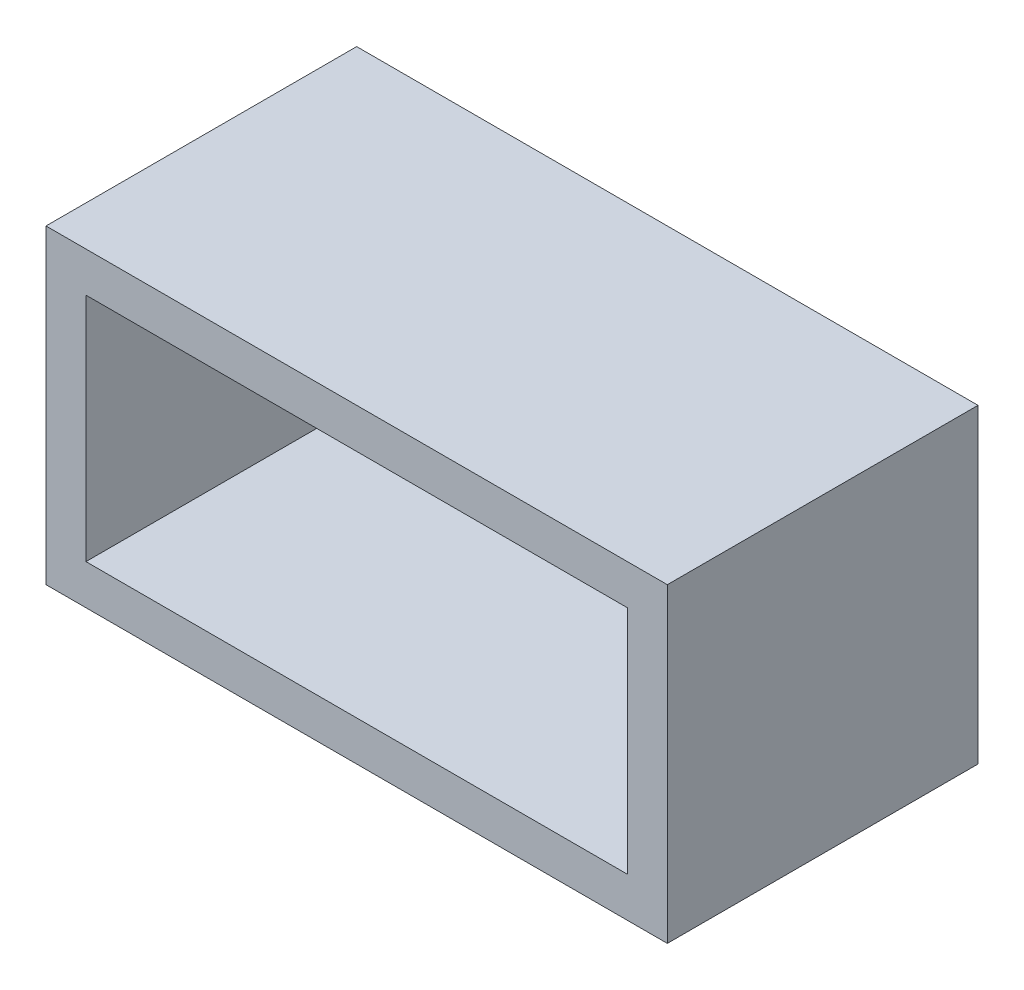
ISO-10303-21;
HEADER;
FILE_DESCRIPTION(('STEP AP214'),'2;1');
FILE_NAME('part.step','',(''),(''),'','','');
FILE_SCHEMA(('AUTOMOTIVE_DESIGN { 1 0 10303 214 1 1 1 1 }'));
ENDSEC;
DATA;
#1=APPLICATION_CONTEXT('core data for automotive mechanical design processes');
#2=APPLICATION_PROTOCOL_DEFINITION('international standard','automotive_design',2000,#1);
#3=PRODUCT_CONTEXT('',#1,'mechanical');
#4=PRODUCT('Part','Part','',(#3));
#5=PRODUCT_RELATED_PRODUCT_CATEGORY('part','',(#4));
#6=PRODUCT_DEFINITION_FORMATION('','',#4);
#7=PRODUCT_DEFINITION_CONTEXT('part definition',#1,'design');
#8=PRODUCT_DEFINITION('design','',#6,#7);
#9=PRODUCT_DEFINITION_SHAPE('','',#8);
#10=(LENGTH_UNIT() NAMED_UNIT(*) SI_UNIT(.MILLI.,.METRE.));
#11=(NAMED_UNIT(*) PLANE_ANGLE_UNIT() SI_UNIT($,.RADIAN.));
#12=(NAMED_UNIT(*) SI_UNIT($,.STERADIAN.) SOLID_ANGLE_UNIT());
#13=UNCERTAINTY_MEASURE_WITH_UNIT(LENGTH_MEASURE(1.E-05),#10,'distance_accuracy_value','');
#14=(GEOMETRIC_REPRESENTATION_CONTEXT(3) GLOBAL_UNCERTAINTY_ASSIGNED_CONTEXT((#13)) GLOBAL_UNIT_ASSIGNED_CONTEXT((#10,
#11,#12)) REPRESENTATION_CONTEXT('',''));
#15=CARTESIAN_POINT('',(0.,0.,0.));
#16=DIRECTION('',(0.,0.,1.));
#17=DIRECTION('',(1.,0.,0.));
#18=AXIS2_PLACEMENT_3D('',#15,#16,#17);
#19=CARTESIAN_POINT('',(0.,0.,6.));
#20=DIRECTION('',(0.,0.,-1.));
#21=DIRECTION('',(-1.,0.,0.));
#22=AXIS2_PLACEMENT_3D('',#19,#20,#21);
#23=PLANE('',#22);
#24=DIRECTION('',(0.,-1.,0.));
#25=VECTOR('',#24,1.);
#26=CARTESIAN_POINT('',(14.,-21.,6.));
#27=LINE('',#26,#25);
#28=CARTESIAN_POINT('',(14.,-14.,6.));
#29=VERTEX_POINT('',#28);
#30=CARTESIAN_POINT('',(14.,-21.,6.));
#31=VERTEX_POINT('',#30);
#32=EDGE_CURVE('E154',#29,#31,#27,.T.);
#33=ORIENTED_EDGE('',*,*,#32,.T.);
#34=DIRECTION('',(1.,0.,0.));
#35=VECTOR('',#34,1.);
#36=CARTESIAN_POINT('',(14.,-21.,6.));
#37=LINE('',#36,#35);
#38=CARTESIAN_POINT('',(28.,-21.,6.));
#39=VERTEX_POINT('',#38);
#40=EDGE_CURVE('E98',#31,#39,#37,.T.);
#41=ORIENTED_EDGE('',*,*,#40,.T.);
#42=DIRECTION('',(0.,1.,0.));
#43=VECTOR('',#42,1.);
#44=CARTESIAN_POINT('',(28.,-21.,6.));
#45=LINE('',#44,#43);
#46=CARTESIAN_POINT('',(28.,-14.,6.));
#47=VERTEX_POINT('',#46);
#48=EDGE_CURVE('E158',#39,#47,#45,.T.);
#49=ORIENTED_EDGE('',*,*,#48,.T.);
#50=DIRECTION('',(-1.,0.,0.));
#51=VECTOR('',#50,1.);
#52=CARTESIAN_POINT('',(14.,-14.,6.));
#53=LINE('',#52,#51);
#54=EDGE_CURVE('E68',#47,#29,#53,.T.);
#55=ORIENTED_EDGE('',*,*,#54,.T.);
#56=EDGE_LOOP('',(#33,#41,#49,#55));
#57=FACE_BOUND('',#56,.T.);
#58=DIRECTION('',(0.,-1.,0.));
#59=VECTOR('',#58,1.);
#60=CARTESIAN_POINT('',(14.9,0.,6.));
#61=LINE('',#60,#59);
#62=CARTESIAN_POINT('',(14.9,-14.9,6.));
#63=VERTEX_POINT('',#62);
#64=CARTESIAN_POINT('',(14.9,-20.1,6.));
#65=VERTEX_POINT('',#64);
#66=EDGE_CURVE('E11',#63,#65,#61,.T.);
#67=ORIENTED_EDGE('',*,*,#66,.F.);
#68=DIRECTION('',(-1.,0.,0.));
#69=VECTOR('',#68,1.);
#70=CARTESIAN_POINT('',(0.,-14.9,6.));
#71=LINE('',#70,#69);
#72=CARTESIAN_POINT('',(27.1,-14.9,6.));
#73=VERTEX_POINT('',#72);
#74=EDGE_CURVE('E176',#73,#63,#71,.T.);
#75=ORIENTED_EDGE('',*,*,#74,.F.);
#76=DIRECTION('',(0.,1.,0.));
#77=VECTOR('',#76,1.);
#78=CARTESIAN_POINT('',(27.1,0.,6.));
#79=LINE('',#78,#77);
#80=CARTESIAN_POINT('',(27.1,-20.1,6.));
#81=VERTEX_POINT('',#80);
#82=EDGE_CURVE('E178',#81,#73,#79,.T.);
#83=ORIENTED_EDGE('',*,*,#82,.F.);
#84=DIRECTION('',(1.,0.,0.));
#85=VECTOR('',#84,1.);
#86=CARTESIAN_POINT('',(0.,-20.1,6.));
#87=LINE('',#86,#85);
#88=EDGE_CURVE('E55',#65,#81,#87,.T.);
#89=ORIENTED_EDGE('',*,*,#88,.F.);
#90=EDGE_LOOP('',(#67,#75,#83,#89));
#91=FACE_BOUND('',#90,.T.);
#92=ADVANCED_FACE('F43',(#57,#91),#23,.F.);
#93=CARTESIAN_POINT('',(14.,-21.,6.));
#94=DIRECTION('',(1.,0.,0.));
#95=DIRECTION('',(0.,0.,-1.));
#96=AXIS2_PLACEMENT_3D('',#93,#94,#95);
#97=PLANE('',#96);
#98=DIRECTION('',(0.,-1.,0.));
#99=VECTOR('',#98,1.);
#100=CARTESIAN_POINT('',(14.,-21.,-1.));
#101=LINE('',#100,#99);
#102=CARTESIAN_POINT('',(14.,-14.,-1.));
#103=VERTEX_POINT('',#102);
#104=CARTESIAN_POINT('',(14.,-21.,-1.));
#105=VERTEX_POINT('',#104);
#106=EDGE_CURVE('E126',#103,#105,#101,.T.);
#107=ORIENTED_EDGE('',*,*,#106,.T.);
#108=DIRECTION('',(0.,0.,-1.));
#109=VECTOR('',#108,1.);
#110=CARTESIAN_POINT('',(14.,-21.,6.));
#111=LINE('',#110,#109);
#112=EDGE_CURVE('E173',#31,#105,#111,.T.);
#113=ORIENTED_EDGE('',*,*,#112,.F.);
#114=ORIENTED_EDGE('',*,*,#32,.F.);
#115=DIRECTION('',(0.,0.,-1.));
#116=VECTOR('',#115,1.);
#117=CARTESIAN_POINT('',(14.,-14.,6.));
#118=LINE('',#117,#116);
#119=EDGE_CURVE('E161',#29,#103,#118,.T.);
#120=ORIENTED_EDGE('',*,*,#119,.T.);
#121=EDGE_LOOP('',(#107,#113,#114,#120));
#122=FACE_BOUND('',#121,.T.);
#123=ADVANCED_FACE('F44',(#122),#97,.F.);
#124=CARTESIAN_POINT('',(14.,-21.,6.));
#125=DIRECTION('',(0.,1.,0.));
#126=DIRECTION('',(0.,0.,1.));
#127=AXIS2_PLACEMENT_3D('',#124,#125,#126);
#128=PLANE('',#127);
#129=DIRECTION('',(1.,0.,0.));
#130=VECTOR('',#129,1.);
#131=CARTESIAN_POINT('',(14.,-21.,-1.));
#132=LINE('',#131,#130);
#133=CARTESIAN_POINT('',(28.,-21.,-1.));
#134=VERTEX_POINT('',#133);
#135=EDGE_CURVE('E163',#105,#134,#132,.T.);
#136=ORIENTED_EDGE('',*,*,#135,.T.);
#137=DIRECTION('',(0.,0.,-1.));
#138=VECTOR('',#137,1.);
#139=CARTESIAN_POINT('',(28.,-21.,6.));
#140=LINE('',#139,#138);
#141=EDGE_CURVE('E175',#39,#134,#140,.T.);
#142=ORIENTED_EDGE('',*,*,#141,.F.);
#143=ORIENTED_EDGE('',*,*,#40,.F.);
#144=ORIENTED_EDGE('',*,*,#112,.T.);
#145=EDGE_LOOP('',(#136,#142,#143,#144));
#146=FACE_BOUND('',#145,.T.);
#147=ADVANCED_FACE('F214',(#146),#128,.F.);
#148=CARTESIAN_POINT('',(28.,-21.,6.));
#149=DIRECTION('',(-1.,0.,0.));
#150=DIRECTION('',(0.,0.,1.));
#151=AXIS2_PLACEMENT_3D('',#148,#149,#150);
#152=PLANE('',#151);
#153=DIRECTION('',(0.,1.,0.));
#154=VECTOR('',#153,1.);
#155=CARTESIAN_POINT('',(28.,-21.,-1.));
#156=LINE('',#155,#154);
#157=CARTESIAN_POINT('',(28.,-14.,-1.));
#158=VERTEX_POINT('',#157);
#159=EDGE_CURVE('E167',#134,#158,#156,.T.);
#160=ORIENTED_EDGE('',*,*,#159,.T.);
#161=DIRECTION('',(0.,0.,-1.));
#162=VECTOR('',#161,1.);
#163=CARTESIAN_POINT('',(28.,-14.,6.));
#164=LINE('',#163,#162);
#165=EDGE_CURVE('E168',#47,#158,#164,.T.);
#166=ORIENTED_EDGE('',*,*,#165,.F.);
#167=ORIENTED_EDGE('',*,*,#48,.F.);
#168=ORIENTED_EDGE('',*,*,#141,.T.);
#169=EDGE_LOOP('',(#160,#166,#167,#168));
#170=FACE_BOUND('',#169,.T.);
#171=ADVANCED_FACE('F227',(#170),#152,.F.);
#172=CARTESIAN_POINT('',(14.,-14.,6.));
#173=DIRECTION('',(0.,-1.,0.));
#174=DIRECTION('',(0.,0.,-1.));
#175=AXIS2_PLACEMENT_3D('',#172,#173,#174);
#176=PLANE('',#175);
#177=DIRECTION('',(-1.,0.,0.));
#178=VECTOR('',#177,1.);
#179=CARTESIAN_POINT('',(14.,-14.,-1.));
#180=LINE('',#179,#178);
#181=EDGE_CURVE('E89',#158,#103,#180,.T.);
#182=ORIENTED_EDGE('',*,*,#181,.T.);
#183=ORIENTED_EDGE('',*,*,#119,.F.);
#184=ORIENTED_EDGE('',*,*,#54,.F.);
#185=ORIENTED_EDGE('',*,*,#165,.T.);
#186=EDGE_LOOP('',(#182,#183,#184,#185));
#187=FACE_BOUND('',#186,.T.);
#188=ADVANCED_FACE('F224',(#187),#176,.F.);
#189=CARTESIAN_POINT('',(0.,0.,-1.));
#190=DIRECTION('',(0.,0.,-1.));
#191=DIRECTION('',(-1.,0.,0.));
#192=AXIS2_PLACEMENT_3D('',#189,#190,#191);
#193=PLANE('',#192);
#194=CARTESIAN_POINT('',(18.,-17.5,-1.));
#195=DIRECTION('',(0.,0.,-1.));
#196=DIRECTION('',(-1.,0.,0.));
#197=AXIS2_PLACEMENT_3D('',#194,#195,#196);
#198=CIRCLE('',#197,1.1);
#199=CARTESIAN_POINT('',(16.9,-17.5,-1.));
#200=VERTEX_POINT('',#199);
#201=EDGE_CURVE('E141',#200,#200,#198,.F.);
#202=ORIENTED_EDGE('',*,*,#201,.T.);
#203=EDGE_LOOP('',(#202));
#204=FACE_BOUND('',#203,.T.);
#205=CARTESIAN_POINT('',(24.,-17.5,-1.));
#206=DIRECTION('',(0.,0.,-1.));
#207=DIRECTION('',(-1.,0.,0.));
#208=AXIS2_PLACEMENT_3D('',#205,#206,#207);
#209=CIRCLE('',#208,1.1);
#210=CARTESIAN_POINT('',(22.9,-17.5,-1.));
#211=VERTEX_POINT('',#210);
#212=EDGE_CURVE('E181',#211,#211,#209,.F.);
#213=ORIENTED_EDGE('',*,*,#212,.T.);
#214=EDGE_LOOP('',(#213));
#215=FACE_BOUND('',#214,.T.);
#216=ORIENTED_EDGE('',*,*,#106,.F.);
#217=ORIENTED_EDGE('',*,*,#181,.F.);
#218=ORIENTED_EDGE('',*,*,#159,.F.);
#219=ORIENTED_EDGE('',*,*,#135,.F.);
#220=EDGE_LOOP('',(#216,#217,#218,#219));
#221=FACE_BOUND('',#220,.T.);
#222=ADVANCED_FACE('F222',(#204,#215,#221),#193,.T.);
#223=CARTESIAN_POINT('',(14.9,-20.1,7.));
#224=DIRECTION('',(1.,0.,0.));
#225=DIRECTION('',(0.,0.,-1.));
#226=AXIS2_PLACEMENT_3D('',#223,#224,#225);
#227=PLANE('',#226);
#228=ORIENTED_EDGE('',*,*,#66,.T.);
#229=DIRECTION('',(0.,0.,-1.));
#230=VECTOR('',#229,1.);
#231=CARTESIAN_POINT('',(14.9,-20.1,7.));
#232=LINE('',#231,#230);
#233=CARTESIAN_POINT('',(14.9,-20.1,0.));
#234=VERTEX_POINT('',#233);
#235=EDGE_CURVE('E116',#65,#234,#232,.T.);
#236=ORIENTED_EDGE('',*,*,#235,.T.);
#237=DIRECTION('',(0.,-1.,0.));
#238=VECTOR('',#237,1.);
#239=CARTESIAN_POINT('',(14.9,-20.1,0.));
#240=LINE('',#239,#238);
#241=CARTESIAN_POINT('',(14.9,-14.9,0.));
#242=VERTEX_POINT('',#241);
#243=EDGE_CURVE('E123',#242,#234,#240,.T.);
#244=ORIENTED_EDGE('',*,*,#243,.F.);
#245=DIRECTION('',(0.,0.,-1.));
#246=VECTOR('',#245,1.);
#247=CARTESIAN_POINT('',(14.9,-14.9,7.));
#248=LINE('',#247,#246);
#249=EDGE_CURVE('E151',#63,#242,#248,.T.);
#250=ORIENTED_EDGE('',*,*,#249,.F.);
#251=EDGE_LOOP('',(#228,#236,#244,#250));
#252=FACE_BOUND('',#251,.T.);
#253=ADVANCED_FACE('F124',(#252),#227,.T.);
#254=CARTESIAN_POINT('',(14.9,-20.1,7.));
#255=DIRECTION('',(0.,1.,0.));
#256=DIRECTION('',(0.,0.,1.));
#257=AXIS2_PLACEMENT_3D('',#254,#255,#256);
#258=PLANE('',#257);
#259=ORIENTED_EDGE('',*,*,#88,.T.);
#260=DIRECTION('',(0.,0.,-1.));
#261=VECTOR('',#260,1.);
#262=CARTESIAN_POINT('',(27.1,-20.1,7.));
#263=LINE('',#262,#261);
#264=CARTESIAN_POINT('',(27.1,-20.1,0.));
#265=VERTEX_POINT('',#264);
#266=EDGE_CURVE('E129',#81,#265,#263,.T.);
#267=ORIENTED_EDGE('',*,*,#266,.T.);
#268=DIRECTION('',(1.,0.,0.));
#269=VECTOR('',#268,1.);
#270=CARTESIAN_POINT('',(14.9,-20.1,0.));
#271=LINE('',#270,#269);
#272=EDGE_CURVE('E135',#234,#265,#271,.T.);
#273=ORIENTED_EDGE('',*,*,#272,.F.);
#274=ORIENTED_EDGE('',*,*,#235,.F.);
#275=EDGE_LOOP('',(#259,#267,#273,#274));
#276=FACE_BOUND('',#275,.T.);
#277=ADVANCED_FACE('F134',(#276),#258,.T.);
#278=CARTESIAN_POINT('',(27.1,-20.1,7.));
#279=DIRECTION('',(-1.,0.,0.));
#280=DIRECTION('',(0.,0.,1.));
#281=AXIS2_PLACEMENT_3D('',#278,#279,#280);
#282=PLANE('',#281);
#283=ORIENTED_EDGE('',*,*,#82,.T.);
#284=DIRECTION('',(0.,0.,-1.));
#285=VECTOR('',#284,1.);
#286=CARTESIAN_POINT('',(27.1,-14.9,7.));
#287=LINE('',#286,#285);
#288=CARTESIAN_POINT('',(27.1,-14.9,0.));
#289=VERTEX_POINT('',#288);
#290=EDGE_CURVE('E58',#73,#289,#287,.T.);
#291=ORIENTED_EDGE('',*,*,#290,.T.);
#292=DIRECTION('',(0.,1.,0.));
#293=VECTOR('',#292,1.);
#294=CARTESIAN_POINT('',(27.1,-20.1,0.));
#295=LINE('',#294,#293);
#296=EDGE_CURVE('E140',#265,#289,#295,.T.);
#297=ORIENTED_EDGE('',*,*,#296,.F.);
#298=ORIENTED_EDGE('',*,*,#266,.F.);
#299=EDGE_LOOP('',(#283,#291,#297,#298));
#300=FACE_BOUND('',#299,.T.);
#301=ADVANCED_FACE('F206',(#300),#282,.T.);
#302=CARTESIAN_POINT('',(14.9,-14.9,7.));
#303=DIRECTION('',(0.,-1.,0.));
#304=DIRECTION('',(0.,0.,-1.));
#305=AXIS2_PLACEMENT_3D('',#302,#303,#304);
#306=PLANE('',#305);
#307=ORIENTED_EDGE('',*,*,#74,.T.);
#308=ORIENTED_EDGE('',*,*,#249,.T.);
#309=DIRECTION('',(-1.,0.,0.));
#310=VECTOR('',#309,1.);
#311=CARTESIAN_POINT('',(14.9,-14.9,0.));
#312=LINE('',#311,#310);
#313=EDGE_CURVE('E142',#289,#242,#312,.T.);
#314=ORIENTED_EDGE('',*,*,#313,.F.);
#315=ORIENTED_EDGE('',*,*,#290,.F.);
#316=EDGE_LOOP('',(#307,#308,#314,#315));
#317=FACE_BOUND('',#316,.T.);
#318=ADVANCED_FACE('F197',(#317),#306,.T.);
#319=CARTESIAN_POINT('',(0.,0.,0.));
#320=DIRECTION('',(0.,0.,-1.));
#321=DIRECTION('',(-1.,0.,0.));
#322=AXIS2_PLACEMENT_3D('',#319,#320,#321);
#323=PLANE('',#322);
#324=CARTESIAN_POINT('',(18.,-17.5,0.));
#325=DIRECTION('',(0.,0.,-1.));
#326=DIRECTION('',(-1.,0.,0.));
#327=AXIS2_PLACEMENT_3D('',#324,#325,#326);
#328=CIRCLE('',#327,1.1);
#329=CARTESIAN_POINT('',(16.9,-17.5,0.));
#330=VERTEX_POINT('',#329);
#331=EDGE_CURVE('E50',#330,#330,#328,.F.);
#332=ORIENTED_EDGE('',*,*,#331,.F.);
#333=EDGE_LOOP('',(#332));
#334=FACE_BOUND('',#333,.T.);
#335=CARTESIAN_POINT('',(24.,-17.5,0.));
#336=DIRECTION('',(0.,0.,-1.));
#337=DIRECTION('',(-1.,0.,0.));
#338=AXIS2_PLACEMENT_3D('',#335,#336,#337);
#339=CIRCLE('',#338,1.1);
#340=CARTESIAN_POINT('',(22.9,-17.5,0.));
#341=VERTEX_POINT('',#340);
#342=EDGE_CURVE('E182',#341,#341,#339,.F.);
#343=ORIENTED_EDGE('',*,*,#342,.F.);
#344=EDGE_LOOP('',(#343));
#345=FACE_BOUND('',#344,.T.);
#346=ORIENTED_EDGE('',*,*,#243,.T.);
#347=ORIENTED_EDGE('',*,*,#272,.T.);
#348=ORIENTED_EDGE('',*,*,#296,.T.);
#349=ORIENTED_EDGE('',*,*,#313,.T.);
#350=EDGE_LOOP('',(#346,#347,#348,#349));
#351=FACE_BOUND('',#350,.T.);
#352=ADVANCED_FACE('F143',(#334,#345,#351),#323,.F.);
#353=CARTESIAN_POINT('',(24.,-17.5,6.));
#354=DIRECTION('',(0.,0.,-1.));
#355=DIRECTION('',(-1.,0.,0.));
#356=AXIS2_PLACEMENT_3D('',#353,#354,#355);
#357=CYLINDRICAL_SURFACE('',#356,1.1);
#358=ORIENTED_EDGE('',*,*,#212,.F.);
#359=EDGE_LOOP('',(#358));
#360=FACE_BOUND('',#359,.T.);
#361=ORIENTED_EDGE('',*,*,#342,.T.);
#362=EDGE_LOOP('',(#361));
#363=FACE_BOUND('',#362,.T.);
#364=ADVANCED_FACE('F198',(#360,#363),#357,.F.);
#365=CARTESIAN_POINT('',(18.,-17.5,6.));
#366=DIRECTION('',(0.,0.,-1.));
#367=DIRECTION('',(-1.,0.,0.));
#368=AXIS2_PLACEMENT_3D('',#365,#366,#367);
#369=CYLINDRICAL_SURFACE('',#368,1.1);
#370=ORIENTED_EDGE('',*,*,#201,.F.);
#371=EDGE_LOOP('',(#370));
#372=FACE_BOUND('',#371,.T.);
#373=ORIENTED_EDGE('',*,*,#331,.T.);
#374=EDGE_LOOP('',(#373));
#375=FACE_BOUND('',#374,.T.);
#376=ADVANCED_FACE('F191',(#372,#375),#369,.F.);
#377=CLOSED_SHELL('',(#92,#123,#147,#171,#188,#222,#253,#277,#301,#318,#352,#364,#376));
#378=MANIFOLD_SOLID_BREP('B2',#377);
#379=ADVANCED_BREP_SHAPE_REPRESENTATION('',(#18,#378),#14);
#380=SHAPE_DEFINITION_REPRESENTATION(#9,#379);
ENDSEC;
END-ISO-10303-21;
